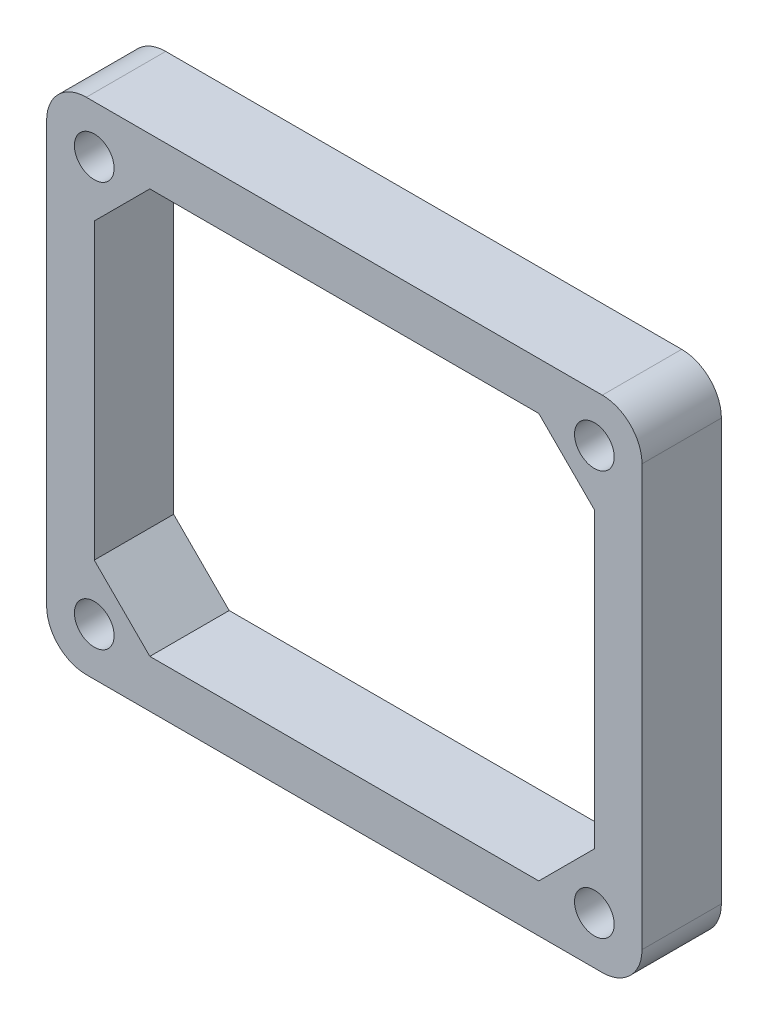
ISO-10303-21;
HEADER;
FILE_DESCRIPTION(('STEP AP214'),'2;1');
FILE_NAME('part.step','',(''),(''),'','','');
FILE_SCHEMA(('AUTOMOTIVE_DESIGN { 1 0 10303 214 1 1 1 1 }'));
ENDSEC;
DATA;
#1=APPLICATION_CONTEXT('core data for automotive mechanical design processes');
#2=APPLICATION_PROTOCOL_DEFINITION('international standard','automotive_design',2000,#1);
#3=PRODUCT_CONTEXT('',#1,'mechanical');
#4=PRODUCT('Part','Part','',(#3));
#5=PRODUCT_RELATED_PRODUCT_CATEGORY('part','',(#4));
#6=PRODUCT_DEFINITION_FORMATION('','',#4);
#7=PRODUCT_DEFINITION_CONTEXT('part definition',#1,'design');
#8=PRODUCT_DEFINITION('design','',#6,#7);
#9=PRODUCT_DEFINITION_SHAPE('','',#8);
#10=(LENGTH_UNIT() NAMED_UNIT(*) SI_UNIT(.MILLI.,.METRE.));
#11=(NAMED_UNIT(*) PLANE_ANGLE_UNIT() SI_UNIT($,.RADIAN.));
#12=(NAMED_UNIT(*) SI_UNIT($,.STERADIAN.) SOLID_ANGLE_UNIT());
#13=UNCERTAINTY_MEASURE_WITH_UNIT(LENGTH_MEASURE(1.E-05),#10,'distance_accuracy_value','');
#14=(GEOMETRIC_REPRESENTATION_CONTEXT(3) GLOBAL_UNCERTAINTY_ASSIGNED_CONTEXT((#13)) GLOBAL_UNIT_ASSIGNED_CONTEXT((#10,
#11,#12)) REPRESENTATION_CONTEXT('',''));
#15=CARTESIAN_POINT('',(0.,0.,0.));
#16=DIRECTION('',(0.,0.,1.));
#17=DIRECTION('',(1.,0.,0.));
#18=AXIS2_PLACEMENT_3D('',#15,#16,#17);
#19=CARTESIAN_POINT('',(0.,0.,10.));
#20=DIRECTION('',(0.,0.,1.));
#21=DIRECTION('',(1.,0.,0.));
#22=AXIS2_PLACEMENT_3D('',#19,#20,#21);
#23=PLANE('',#22);
#24=CARTESIAN_POINT('',(29.6815008445946,-39.8969594594595,10.));
#25=DIRECTION('',(0.,0.,1.));
#26=DIRECTION('',(1.,0.,0.));
#27=AXIS2_PLACEMENT_3D('',#24,#25,#26);
#28=CIRCLE('',#27,2.5);
#29=CARTESIAN_POINT('',(32.1815008445946,-39.8969594594595,10.));
#30=VERTEX_POINT('',#29);
#31=EDGE_CURVE('E569',#30,#30,#28,.T.);
#32=ORIENTED_EDGE('',*,*,#31,.F.);
#33=EDGE_LOOP('',(#32));
#34=FACE_BOUND('',#33,.T.);
#35=CARTESIAN_POINT('',(-33.3184991554054,11.1030405405405,10.));
#36=DIRECTION('',(0.,0.,1.));
#37=DIRECTION('',(1.,0.,0.));
#38=AXIS2_PLACEMENT_3D('',#35,#36,#37);
#39=CIRCLE('',#38,2.5);
#40=CARTESIAN_POINT('',(-30.8184991554054,11.1030405405405,10.));
#41=VERTEX_POINT('',#40);
#42=EDGE_CURVE('E207',#41,#41,#39,.T.);
#43=ORIENTED_EDGE('',*,*,#42,.F.);
#44=EDGE_LOOP('',(#43));
#45=FACE_BOUND('',#44,.T.);
#46=DIRECTION('',(0.,-1.,0.));
#47=VECTOR('',#46,1.);
#48=CARTESIAN_POINT('',(-39.3184991554054,17.1030405405405,10.));
#49=LINE('',#48,#47);
#50=CARTESIAN_POINT('',(-39.3184991554054,12.1030405405405,10.));
#51=VERTEX_POINT('',#50);
#52=CARTESIAN_POINT('',(-39.3184991554054,-40.8969594594595,10.));
#53=VERTEX_POINT('',#52);
#54=EDGE_CURVE('E252',#51,#53,#49,.T.);
#55=ORIENTED_EDGE('',*,*,#54,.T.);
#56=CARTESIAN_POINT('',(-34.3184991554054,-40.8969594594595,10.));
#57=DIRECTION('',(0.,0.,1.));
#58=DIRECTION('',(1.,0.,0.));
#59=AXIS2_PLACEMENT_3D('',#56,#57,#58);
#60=CIRCLE('',#59,5.);
#61=CARTESIAN_POINT('',(-34.3184991554054,-45.8969594594595,10.));
#62=VERTEX_POINT('',#61);
#63=EDGE_CURVE('E314',#53,#62,#60,.T.);
#64=ORIENTED_EDGE('',*,*,#63,.T.);
#65=DIRECTION('',(1.,0.,0.));
#66=VECTOR('',#65,1.);
#67=CARTESIAN_POINT('',(-39.3184991554054,-45.8969594594595,10.));
#68=LINE('',#67,#66);
#69=CARTESIAN_POINT('',(30.6815008445947,-45.8969594594595,10.));
#70=VERTEX_POINT('',#69);
#71=EDGE_CURVE('E256',#62,#70,#68,.T.);
#72=ORIENTED_EDGE('',*,*,#71,.T.);
#73=CARTESIAN_POINT('',(30.6815008445946,-40.8969594594595,10.));
#74=DIRECTION('',(0.,0.,1.));
#75=DIRECTION('',(1.,0.,0.));
#76=AXIS2_PLACEMENT_3D('',#73,#74,#75);
#77=CIRCLE('',#76,5.);
#78=CARTESIAN_POINT('',(35.6815008445947,-40.8969594594595,10.));
#79=VERTEX_POINT('',#78);
#80=EDGE_CURVE('E311',#70,#79,#77,.T.);
#81=ORIENTED_EDGE('',*,*,#80,.T.);
#82=DIRECTION('',(0.,1.,0.));
#83=VECTOR('',#82,1.);
#84=CARTESIAN_POINT('',(35.6815008445946,17.1030405405405,10.));
#85=LINE('',#84,#83);
#86=CARTESIAN_POINT('',(35.6815008445946,12.1030405405405,10.));
#87=VERTEX_POINT('',#86);
#88=EDGE_CURVE('E261',#79,#87,#85,.T.);
#89=ORIENTED_EDGE('',*,*,#88,.T.);
#90=CARTESIAN_POINT('',(30.6815008445946,12.1030405405405,10.));
#91=DIRECTION('',(0.,0.,1.));
#92=DIRECTION('',(1.,0.,0.));
#93=AXIS2_PLACEMENT_3D('',#90,#91,#92);
#94=CIRCLE('',#93,5.);
#95=CARTESIAN_POINT('',(30.6815008445946,17.1030405405405,10.));
#96=VERTEX_POINT('',#95);
#97=EDGE_CURVE('E61',#87,#96,#94,.T.);
#98=ORIENTED_EDGE('',*,*,#97,.T.);
#99=DIRECTION('',(-1.,0.,0.));
#100=VECTOR('',#99,1.);
#101=CARTESIAN_POINT('',(-39.3184991554054,17.1030405405405,10.));
#102=LINE('',#101,#100);
#103=CARTESIAN_POINT('',(-34.3184991554054,17.1030405405405,10.));
#104=VERTEX_POINT('',#103);
#105=EDGE_CURVE('E264',#96,#104,#102,.T.);
#106=ORIENTED_EDGE('',*,*,#105,.T.);
#107=CARTESIAN_POINT('',(-34.3184991554054,12.1030405405405,10.));
#108=DIRECTION('',(0.,0.,1.));
#109=DIRECTION('',(1.,0.,0.));
#110=AXIS2_PLACEMENT_3D('',#107,#108,#109);
#111=CIRCLE('',#110,5.);
#112=EDGE_CURVE('E306',#104,#51,#111,.T.);
#113=ORIENTED_EDGE('',*,*,#112,.T.);
#114=EDGE_LOOP('',(#55,#64,#72,#81,#89,#98,#106,#113));
#115=FACE_BOUND('',#114,.T.);
#116=DIRECTION('',(-0.707106781186547,-0.707106781186548,0.));
#117=VECTOR('',#116,1.);
#118=CARTESIAN_POINT('',(-33.3184991554054,4.10304054054053,10.));
#119=LINE('',#118,#117);
#120=CARTESIAN_POINT('',(-26.3184991554054,11.1030405405405,10.));
#121=VERTEX_POINT('',#120);
#122=CARTESIAN_POINT('',(-33.3184991554054,4.10304054054053,10.));
#123=VERTEX_POINT('',#122);
#124=EDGE_CURVE('E166',#121,#123,#119,.T.);
#125=ORIENTED_EDGE('',*,*,#124,.F.);
#126=DIRECTION('',(-1.,0.,0.));
#127=VECTOR('',#126,1.);
#128=CARTESIAN_POINT('',(-26.3184991554054,11.1030405405405,10.));
#129=LINE('',#128,#127);
#130=CARTESIAN_POINT('',(22.6815008445946,11.1030405405405,10.));
#131=VERTEX_POINT('',#130);
#132=EDGE_CURVE('E155',#131,#121,#129,.T.);
#133=ORIENTED_EDGE('',*,*,#132,.F.);
#134=DIRECTION('',(-0.707106781186547,0.707106781186548,0.));
#135=VECTOR('',#134,1.);
#136=CARTESIAN_POINT('',(22.6815008445946,11.1030405405405,10.));
#137=LINE('',#136,#135);
#138=CARTESIAN_POINT('',(29.6815008445946,4.10304054054053,10.));
#139=VERTEX_POINT('',#138);
#140=EDGE_CURVE('E201',#139,#131,#137,.T.);
#141=ORIENTED_EDGE('',*,*,#140,.F.);
#142=DIRECTION('',(0.,1.,0.));
#143=VECTOR('',#142,1.);
#144=CARTESIAN_POINT('',(29.6815008445946,4.10304054054053,10.));
#145=LINE('',#144,#143);
#146=CARTESIAN_POINT('',(29.6815008445946,-32.8969594594595,10.));
#147=VERTEX_POINT('',#146);
#148=EDGE_CURVE('E197',#147,#139,#145,.T.);
#149=ORIENTED_EDGE('',*,*,#148,.F.);
#150=DIRECTION('',(0.707106781186547,0.707106781186547,0.));
#151=VECTOR('',#150,1.);
#152=CARTESIAN_POINT('',(29.6815008445946,-32.8969594594595,10.));
#153=LINE('',#152,#151);
#154=CARTESIAN_POINT('',(22.6815008445946,-39.8969594594595,10.));
#155=VERTEX_POINT('',#154);
#156=EDGE_CURVE('E194',#155,#147,#153,.T.);
#157=ORIENTED_EDGE('',*,*,#156,.F.);
#158=DIRECTION('',(1.,0.,0.));
#159=VECTOR('',#158,1.);
#160=CARTESIAN_POINT('',(-26.3184991554054,-39.8969594594595,10.));
#161=LINE('',#160,#159);
#162=CARTESIAN_POINT('',(-26.3184991554054,-39.8969594594595,10.));
#163=VERTEX_POINT('',#162);
#164=EDGE_CURVE('E191',#163,#155,#161,.T.);
#165=ORIENTED_EDGE('',*,*,#164,.F.);
#166=DIRECTION('',(0.707106781186547,-0.707106781186547,0.));
#167=VECTOR('',#166,1.);
#168=CARTESIAN_POINT('',(-33.3184991554054,-32.8969594594595,10.));
#169=LINE('',#168,#167);
#170=CARTESIAN_POINT('',(-33.3184991554054,-32.8969594594595,10.));
#171=VERTEX_POINT('',#170);
#172=EDGE_CURVE('E185',#171,#163,#169,.T.);
#173=ORIENTED_EDGE('',*,*,#172,.F.);
#174=DIRECTION('',(0.,-1.,0.));
#175=VECTOR('',#174,1.);
#176=CARTESIAN_POINT('',(-33.3184991554054,4.10304054054053,10.));
#177=LINE('',#176,#175);
#178=EDGE_CURVE('E181',#123,#171,#177,.T.);
#179=ORIENTED_EDGE('',*,*,#178,.F.);
#180=EDGE_LOOP('',(#125,#133,#141,#149,#157,#165,#173,#179));
#181=FACE_BOUND('',#180,.T.);
#182=CARTESIAN_POINT('',(29.6815008445946,11.1030405405405,10.));
#183=DIRECTION('',(0.,0.,1.));
#184=DIRECTION('',(1.,0.,0.));
#185=AXIS2_PLACEMENT_3D('',#182,#183,#184);
#186=CIRCLE('',#185,2.5);
#187=CARTESIAN_POINT('',(32.1815008445946,11.1030405405405,10.));
#188=VERTEX_POINT('',#187);
#189=EDGE_CURVE('E577',#188,#188,#186,.T.);
#190=ORIENTED_EDGE('',*,*,#189,.F.);
#191=EDGE_LOOP('',(#190));
#192=FACE_BOUND('',#191,.T.);
#193=CARTESIAN_POINT('',(-33.3184991554054,-39.8969594594595,10.));
#194=DIRECTION('',(0.,0.,1.));
#195=DIRECTION('',(1.,0.,0.));
#196=AXIS2_PLACEMENT_3D('',#193,#194,#195);
#197=CIRCLE('',#196,2.5);
#198=CARTESIAN_POINT('',(-30.8184991554054,-39.8969594594595,10.));
#199=VERTEX_POINT('',#198);
#200=EDGE_CURVE('E558',#199,#199,#197,.T.);
#201=ORIENTED_EDGE('',*,*,#200,.F.);
#202=EDGE_LOOP('',(#201));
#203=FACE_BOUND('',#202,.T.);
#204=ADVANCED_FACE('F39',(#34,#45,#115,#181,#192,#203),#23,.T.);
#205=CARTESIAN_POINT('',(0.,0.,0.));
#206=DIRECTION('',(0.,0.,1.));
#207=DIRECTION('',(1.,0.,0.));
#208=AXIS2_PLACEMENT_3D('',#205,#206,#207);
#209=PLANE('',#208);
#210=DIRECTION('',(1.,0.,0.));
#211=VECTOR('',#210,1.);
#212=CARTESIAN_POINT('',(-39.3184991554054,-45.8969594594595,0.));
#213=LINE('',#212,#211);
#214=CARTESIAN_POINT('',(-34.3184991554054,-45.8969594594595,0.));
#215=VERTEX_POINT('',#214);
#216=CARTESIAN_POINT('',(30.6815008445947,-45.8969594594595,0.));
#217=VERTEX_POINT('',#216);
#218=EDGE_CURVE('E271',#215,#217,#213,.T.);
#219=ORIENTED_EDGE('',*,*,#218,.F.);
#220=CARTESIAN_POINT('',(-34.3184991554054,-40.8969594594595,0.));
#221=DIRECTION('',(0.,0.,1.));
#222=DIRECTION('',(1.,0.,0.));
#223=AXIS2_PLACEMENT_3D('',#220,#221,#222);
#224=CIRCLE('',#223,5.);
#225=CARTESIAN_POINT('',(-39.3184991554054,-40.8969594594595,0.));
#226=VERTEX_POINT('',#225);
#227=EDGE_CURVE('E296',#215,#226,#224,.F.);
#228=ORIENTED_EDGE('',*,*,#227,.T.);
#229=DIRECTION('',(0.,-1.,0.));
#230=VECTOR('',#229,1.);
#231=CARTESIAN_POINT('',(-39.3184991554054,17.1030405405405,0.));
#232=LINE('',#231,#230);
#233=CARTESIAN_POINT('',(-39.3184991554054,12.1030405405405,0.));
#234=VERTEX_POINT('',#233);
#235=EDGE_CURVE('E175',#234,#226,#232,.T.);
#236=ORIENTED_EDGE('',*,*,#235,.F.);
#237=CARTESIAN_POINT('',(-34.3184991554054,12.1030405405405,0.));
#238=DIRECTION('',(0.,0.,1.));
#239=DIRECTION('',(1.,0.,0.));
#240=AXIS2_PLACEMENT_3D('',#237,#238,#239);
#241=CIRCLE('',#240,5.);
#242=CARTESIAN_POINT('',(-34.3184991554054,17.1030405405405,0.));
#243=VERTEX_POINT('',#242);
#244=EDGE_CURVE('E287',#234,#243,#241,.F.);
#245=ORIENTED_EDGE('',*,*,#244,.T.);
#246=DIRECTION('',(-1.,0.,0.));
#247=VECTOR('',#246,1.);
#248=CARTESIAN_POINT('',(-39.3184991554054,17.1030405405405,0.));
#249=LINE('',#248,#247);
#250=CARTESIAN_POINT('',(30.6815008445946,17.1030405405405,0.));
#251=VERTEX_POINT('',#250);
#252=EDGE_CURVE('E257',#251,#243,#249,.T.);
#253=ORIENTED_EDGE('',*,*,#252,.F.);
#254=CARTESIAN_POINT('',(30.6815008445946,12.1030405405405,0.));
#255=DIRECTION('',(0.,0.,1.));
#256=DIRECTION('',(1.,0.,0.));
#257=AXIS2_PLACEMENT_3D('',#254,#255,#256);
#258=CIRCLE('',#257,5.);
#259=CARTESIAN_POINT('',(35.6815008445946,12.1030405405405,0.));
#260=VERTEX_POINT('',#259);
#261=EDGE_CURVE('E290',#251,#260,#258,.F.);
#262=ORIENTED_EDGE('',*,*,#261,.T.);
#263=DIRECTION('',(0.,1.,0.));
#264=VECTOR('',#263,1.);
#265=CARTESIAN_POINT('',(35.6815008445946,17.1030405405405,0.));
#266=LINE('',#265,#264);
#267=CARTESIAN_POINT('',(35.6815008445947,-40.8969594594595,0.));
#268=VERTEX_POINT('',#267);
#269=EDGE_CURVE('E275',#268,#260,#266,.T.);
#270=ORIENTED_EDGE('',*,*,#269,.F.);
#271=CARTESIAN_POINT('',(30.6815008445946,-40.8969594594595,0.));
#272=DIRECTION('',(0.,0.,1.));
#273=DIRECTION('',(1.,0.,0.));
#274=AXIS2_PLACEMENT_3D('',#271,#272,#273);
#275=CIRCLE('',#274,5.);
#276=EDGE_CURVE('E293',#268,#217,#275,.F.);
#277=ORIENTED_EDGE('',*,*,#276,.T.);
#278=EDGE_LOOP('',(#219,#228,#236,#245,#253,#262,#270,#277));
#279=FACE_BOUND('',#278,.T.);
#280=DIRECTION('',(-1.,0.,0.));
#281=VECTOR('',#280,1.);
#282=CARTESIAN_POINT('',(-26.3184991554054,11.1030405405405,0.));
#283=LINE('',#282,#281);
#284=CARTESIAN_POINT('',(22.6815008445946,11.1030405405405,0.));
#285=VERTEX_POINT('',#284);
#286=CARTESIAN_POINT('',(-26.3184991554054,11.1030405405405,0.));
#287=VERTEX_POINT('',#286);
#288=EDGE_CURVE('E204',#285,#287,#283,.T.);
#289=ORIENTED_EDGE('',*,*,#288,.T.);
#290=DIRECTION('',(-0.707106781186547,-0.707106781186548,0.));
#291=VECTOR('',#290,1.);
#292=CARTESIAN_POINT('',(-33.3184991554054,4.10304054054053,0.));
#293=LINE('',#292,#291);
#294=CARTESIAN_POINT('',(-33.3184991554054,4.10304054054053,0.));
#295=VERTEX_POINT('',#294);
#296=EDGE_CURVE('E173',#287,#295,#293,.T.);
#297=ORIENTED_EDGE('',*,*,#296,.T.);
#298=DIRECTION('',(0.,-1.,0.));
#299=VECTOR('',#298,1.);
#300=CARTESIAN_POINT('',(-33.3184991554054,4.10304054054053,0.));
#301=LINE('',#300,#299);
#302=CARTESIAN_POINT('',(-33.3184991554054,-32.8969594594595,0.));
#303=VERTEX_POINT('',#302);
#304=EDGE_CURVE('E210',#295,#303,#301,.T.);
#305=ORIENTED_EDGE('',*,*,#304,.T.);
#306=DIRECTION('',(0.707106781186547,-0.707106781186547,0.));
#307=VECTOR('',#306,1.);
#308=CARTESIAN_POINT('',(-33.3184991554054,-32.8969594594595,0.));
#309=LINE('',#308,#307);
#310=CARTESIAN_POINT('',(-26.3184991554054,-39.8969594594595,0.));
#311=VERTEX_POINT('',#310);
#312=EDGE_CURVE('E214',#303,#311,#309,.T.);
#313=ORIENTED_EDGE('',*,*,#312,.T.);
#314=DIRECTION('',(1.,0.,0.));
#315=VECTOR('',#314,1.);
#316=CARTESIAN_POINT('',(-26.3184991554054,-39.8969594594595,0.));
#317=LINE('',#316,#315);
#318=CARTESIAN_POINT('',(22.6815008445946,-39.8969594594595,0.));
#319=VERTEX_POINT('',#318);
#320=EDGE_CURVE('E218',#311,#319,#317,.T.);
#321=ORIENTED_EDGE('',*,*,#320,.T.);
#322=DIRECTION('',(0.707106781186547,0.707106781186547,0.));
#323=VECTOR('',#322,1.);
#324=CARTESIAN_POINT('',(29.6815008445946,-32.8969594594595,0.));
#325=LINE('',#324,#323);
#326=CARTESIAN_POINT('',(29.6815008445946,-32.8969594594595,0.));
#327=VERTEX_POINT('',#326);
#328=EDGE_CURVE('E222',#319,#327,#325,.T.);
#329=ORIENTED_EDGE('',*,*,#328,.T.);
#330=DIRECTION('',(0.,1.,0.));
#331=VECTOR('',#330,1.);
#332=CARTESIAN_POINT('',(29.6815008445946,4.10304054054053,0.));
#333=LINE('',#332,#331);
#334=CARTESIAN_POINT('',(29.6815008445946,4.10304054054053,0.));
#335=VERTEX_POINT('',#334);
#336=EDGE_CURVE('E226',#327,#335,#333,.T.);
#337=ORIENTED_EDGE('',*,*,#336,.T.);
#338=DIRECTION('',(-0.707106781186547,0.707106781186548,0.));
#339=VECTOR('',#338,1.);
#340=CARTESIAN_POINT('',(22.6815008445946,11.1030405405405,0.));
#341=LINE('',#340,#339);
#342=EDGE_CURVE('E167',#335,#285,#341,.T.);
#343=ORIENTED_EDGE('',*,*,#342,.T.);
#344=EDGE_LOOP('',(#289,#297,#305,#313,#321,#329,#337,#343));
#345=FACE_BOUND('',#344,.T.);
#346=CARTESIAN_POINT('',(-33.3184991554054,11.1030405405405,0.));
#347=DIRECTION('',(0.,0.,1.));
#348=DIRECTION('',(1.,0.,0.));
#349=AXIS2_PLACEMENT_3D('',#346,#347,#348);
#350=CIRCLE('',#349,2.5);
#351=CARTESIAN_POINT('',(-30.8184991554054,11.1030405405405,0.));
#352=VERTEX_POINT('',#351);
#353=EDGE_CURVE('E581',#352,#352,#350,.T.);
#354=ORIENTED_EDGE('',*,*,#353,.T.);
#355=EDGE_LOOP('',(#354));
#356=FACE_BOUND('',#355,.T.);
#357=CARTESIAN_POINT('',(29.6815008445946,11.1030405405405,0.));
#358=DIRECTION('',(0.,0.,1.));
#359=DIRECTION('',(1.,0.,0.));
#360=AXIS2_PLACEMENT_3D('',#357,#358,#359);
#361=CIRCLE('',#360,2.5);
#362=CARTESIAN_POINT('',(32.1815008445946,11.1030405405405,0.));
#363=VERTEX_POINT('',#362);
#364=EDGE_CURVE('E573',#363,#363,#361,.T.);
#365=ORIENTED_EDGE('',*,*,#364,.T.);
#366=EDGE_LOOP('',(#365));
#367=FACE_BOUND('',#366,.T.);
#368=CARTESIAN_POINT('',(29.6815008445946,-39.8969594594595,0.));
#369=DIRECTION('',(0.,0.,1.));
#370=DIRECTION('',(1.,0.,0.));
#371=AXIS2_PLACEMENT_3D('',#368,#369,#370);
#372=CIRCLE('',#371,2.5);
#373=CARTESIAN_POINT('',(32.1815008445946,-39.8969594594595,0.));
#374=VERTEX_POINT('',#373);
#375=EDGE_CURVE('E566',#374,#374,#372,.T.);
#376=ORIENTED_EDGE('',*,*,#375,.T.);
#377=EDGE_LOOP('',(#376));
#378=FACE_BOUND('',#377,.T.);
#379=CARTESIAN_POINT('',(-33.3184991554054,-39.8969594594595,0.));
#380=DIRECTION('',(0.,0.,1.));
#381=DIRECTION('',(1.,0.,0.));
#382=AXIS2_PLACEMENT_3D('',#379,#380,#381);
#383=CIRCLE('',#382,2.5);
#384=CARTESIAN_POINT('',(-30.8184991554054,-39.8969594594595,0.));
#385=VERTEX_POINT('',#384);
#386=EDGE_CURVE('E561',#385,#385,#383,.T.);
#387=ORIENTED_EDGE('',*,*,#386,.T.);
#388=EDGE_LOOP('',(#387));
#389=FACE_BOUND('',#388,.T.);
#390=ADVANCED_FACE('F334',(#279,#345,#356,#367,#378,#389),#209,.F.);
#391=CARTESIAN_POINT('',(-39.3184991554054,17.1030405405405,10.));
#392=DIRECTION('',(1.,0.,0.));
#393=DIRECTION('',(0.,1.,0.));
#394=AXIS2_PLACEMENT_3D('',#391,#392,#393);
#395=PLANE('',#394);
#396=ORIENTED_EDGE('',*,*,#235,.T.);
#397=DIRECTION('',(0.,0.,-1.));
#398=VECTOR('',#397,1.);
#399=CARTESIAN_POINT('',(-39.3184991554054,-40.8969594594595,10.));
#400=LINE('',#399,#398);
#401=EDGE_CURVE('E303',#226,#53,#400,.F.);
#402=ORIENTED_EDGE('',*,*,#401,.T.);
#403=ORIENTED_EDGE('',*,*,#54,.F.);
#404=DIRECTION('',(0.,0.,-1.));
#405=VECTOR('',#404,1.);
#406=CARTESIAN_POINT('',(-39.3184991554054,12.1030405405405,10.));
#407=LINE('',#406,#405);
#408=EDGE_CURVE('E299',#51,#234,#407,.T.);
#409=ORIENTED_EDGE('',*,*,#408,.T.);
#410=EDGE_LOOP('',(#396,#402,#403,#409));
#411=FACE_BOUND('',#410,.T.);
#412=ADVANCED_FACE('F347',(#411),#395,.F.);
#413=CARTESIAN_POINT('',(-39.3184991554054,-45.8969594594595,10.));
#414=DIRECTION('',(0.,1.,0.));
#415=DIRECTION('',(0.,0.,1.));
#416=AXIS2_PLACEMENT_3D('',#413,#414,#415);
#417=PLANE('',#416);
#418=ORIENTED_EDGE('',*,*,#71,.F.);
#419=DIRECTION('',(0.,0.,-1.));
#420=VECTOR('',#419,1.);
#421=CARTESIAN_POINT('',(-34.3184991554054,-45.8969594594595,10.));
#422=LINE('',#421,#420);
#423=EDGE_CURVE('E283',#62,#215,#422,.T.);
#424=ORIENTED_EDGE('',*,*,#423,.T.);
#425=ORIENTED_EDGE('',*,*,#218,.T.);
#426=DIRECTION('',(0.,0.,-1.));
#427=VECTOR('',#426,1.);
#428=CARTESIAN_POINT('',(30.6815008445947,-45.8969594594595,10.));
#429=LINE('',#428,#427);
#430=EDGE_CURVE('E267',#217,#70,#429,.F.);
#431=ORIENTED_EDGE('',*,*,#430,.T.);
#432=EDGE_LOOP('',(#418,#424,#425,#431));
#433=FACE_BOUND('',#432,.T.);
#434=ADVANCED_FACE('F355',(#433),#417,.F.);
#435=CARTESIAN_POINT('',(35.6815008445946,17.1030405405405,10.));
#436=DIRECTION('',(-1.,0.,0.));
#437=DIRECTION('',(0.,-1.,0.));
#438=AXIS2_PLACEMENT_3D('',#435,#436,#437);
#439=PLANE('',#438);
#440=ORIENTED_EDGE('',*,*,#88,.F.);
#441=DIRECTION('',(0.,0.,-1.));
#442=VECTOR('',#441,1.);
#443=CARTESIAN_POINT('',(35.6815008445947,-40.8969594594595,10.));
#444=LINE('',#443,#442);
#445=EDGE_CURVE('E320',#79,#268,#444,.T.);
#446=ORIENTED_EDGE('',*,*,#445,.T.);
#447=ORIENTED_EDGE('',*,*,#269,.T.);
#448=DIRECTION('',(0.,0.,-1.));
#449=VECTOR('',#448,1.);
#450=CARTESIAN_POINT('',(35.6815008445946,12.1030405405405,10.));
#451=LINE('',#450,#449);
#452=EDGE_CURVE('E317',#260,#87,#451,.F.);
#453=ORIENTED_EDGE('',*,*,#452,.T.);
#454=EDGE_LOOP('',(#440,#446,#447,#453));
#455=FACE_BOUND('',#454,.T.);
#456=ADVANCED_FACE('F328',(#455),#439,.F.);
#457=CARTESIAN_POINT('',(-39.3184991554054,17.1030405405405,10.));
#458=DIRECTION('',(0.,-1.,0.));
#459=DIRECTION('',(0.,0.,-1.));
#460=AXIS2_PLACEMENT_3D('',#457,#458,#459);
#461=PLANE('',#460);
#462=ORIENTED_EDGE('',*,*,#105,.F.);
#463=DIRECTION('',(0.,0.,-1.));
#464=VECTOR('',#463,1.);
#465=CARTESIAN_POINT('',(30.6815008445946,17.1030405405405,10.));
#466=LINE('',#465,#464);
#467=EDGE_CURVE('E11',#96,#251,#466,.T.);
#468=ORIENTED_EDGE('',*,*,#467,.T.);
#469=ORIENTED_EDGE('',*,*,#252,.T.);
#470=DIRECTION('',(0.,0.,-1.));
#471=VECTOR('',#470,1.);
#472=CARTESIAN_POINT('',(-34.3184991554054,17.1030405405405,10.));
#473=LINE('',#472,#471);
#474=EDGE_CURVE('E48',#243,#104,#473,.F.);
#475=ORIENTED_EDGE('',*,*,#474,.T.);
#476=EDGE_LOOP('',(#462,#468,#469,#475));
#477=FACE_BOUND('',#476,.T.);
#478=ADVANCED_FACE('F340',(#477),#461,.F.);
#479=CARTESIAN_POINT('',(-26.3184991554054,11.1030405405405,10.));
#480=DIRECTION('',(0.,-1.,0.));
#481=DIRECTION('',(0.,0.,-1.));
#482=AXIS2_PLACEMENT_3D('',#479,#480,#481);
#483=PLANE('',#482);
#484=ORIENTED_EDGE('',*,*,#288,.F.);
#485=DIRECTION('',(0.,0.,-1.));
#486=VECTOR('',#485,1.);
#487=CARTESIAN_POINT('',(22.6815008445946,11.1030405405405,10.));
#488=LINE('',#487,#486);
#489=EDGE_CURVE('E161',#131,#285,#488,.T.);
#490=ORIENTED_EDGE('',*,*,#489,.F.);
#491=ORIENTED_EDGE('',*,*,#132,.T.);
#492=DIRECTION('',(0.,0.,-1.));
#493=VECTOR('',#492,1.);
#494=CARTESIAN_POINT('',(-26.3184991554054,11.1030405405405,10.));
#495=LINE('',#494,#493);
#496=EDGE_CURVE('E158',#121,#287,#495,.T.);
#497=ORIENTED_EDGE('',*,*,#496,.T.);
#498=EDGE_LOOP('',(#484,#490,#491,#497));
#499=FACE_BOUND('',#498,.T.);
#500=ADVANCED_FACE('F157',(#499),#483,.T.);
#501=CARTESIAN_POINT('',(-33.3184991554054,4.10304054054053,10.));
#502=DIRECTION('',(0.707106781186548,-0.707106781186547,0.));
#503=DIRECTION('',(0.707106781186547,0.707106781186548,0.));
#504=AXIS2_PLACEMENT_3D('',#501,#502,#503);
#505=PLANE('',#504);
#506=ORIENTED_EDGE('',*,*,#296,.F.);
#507=ORIENTED_EDGE('',*,*,#496,.F.);
#508=ORIENTED_EDGE('',*,*,#124,.T.);
#509=DIRECTION('',(0.,0.,-1.));
#510=VECTOR('',#509,1.);
#511=CARTESIAN_POINT('',(-33.3184991554054,4.10304054054053,10.));
#512=LINE('',#511,#510);
#513=EDGE_CURVE('E176',#123,#295,#512,.T.);
#514=ORIENTED_EDGE('',*,*,#513,.T.);
#515=EDGE_LOOP('',(#506,#507,#508,#514));
#516=FACE_BOUND('',#515,.T.);
#517=ADVANCED_FACE('F170',(#516),#505,.T.);
#518=CARTESIAN_POINT('',(-33.3184991554054,4.10304054054053,10.));
#519=DIRECTION('',(1.,0.,0.));
#520=DIRECTION('',(0.,1.,0.));
#521=AXIS2_PLACEMENT_3D('',#518,#519,#520);
#522=PLANE('',#521);
#523=ORIENTED_EDGE('',*,*,#304,.F.);
#524=ORIENTED_EDGE('',*,*,#513,.F.);
#525=ORIENTED_EDGE('',*,*,#178,.T.);
#526=DIRECTION('',(0.,0.,-1.));
#527=VECTOR('',#526,1.);
#528=CARTESIAN_POINT('',(-33.3184991554054,-32.8969594594595,10.));
#529=LINE('',#528,#527);
#530=EDGE_CURVE('E247',#171,#303,#529,.T.);
#531=ORIENTED_EDGE('',*,*,#530,.T.);
#532=EDGE_LOOP('',(#523,#524,#525,#531));
#533=FACE_BOUND('',#532,.T.);
#534=ADVANCED_FACE('F413',(#533),#522,.T.);
#535=CARTESIAN_POINT('',(-33.3184991554054,-32.8969594594595,10.));
#536=DIRECTION('',(0.707106781186548,0.707106781186548,0.));
#537=DIRECTION('',(-0.707106781186548,0.707106781186548,0.));
#538=AXIS2_PLACEMENT_3D('',#535,#536,#537);
#539=PLANE('',#538);
#540=ORIENTED_EDGE('',*,*,#312,.F.);
#541=ORIENTED_EDGE('',*,*,#530,.F.);
#542=ORIENTED_EDGE('',*,*,#172,.T.);
#543=DIRECTION('',(0.,0.,-1.));
#544=VECTOR('',#543,1.);
#545=CARTESIAN_POINT('',(-26.3184991554054,-39.8969594594595,10.));
#546=LINE('',#545,#544);
#547=EDGE_CURVE('E244',#163,#311,#546,.T.);
#548=ORIENTED_EDGE('',*,*,#547,.T.);
#549=EDGE_LOOP('',(#540,#541,#542,#548));
#550=FACE_BOUND('',#549,.T.);
#551=ADVANCED_FACE('F419',(#550),#539,.T.);
#552=CARTESIAN_POINT('',(-26.3184991554054,-39.8969594594595,10.));
#553=DIRECTION('',(0.,1.,0.));
#554=DIRECTION('',(0.,0.,1.));
#555=AXIS2_PLACEMENT_3D('',#552,#553,#554);
#556=PLANE('',#555);
#557=ORIENTED_EDGE('',*,*,#320,.F.);
#558=ORIENTED_EDGE('',*,*,#547,.F.);
#559=ORIENTED_EDGE('',*,*,#164,.T.);
#560=DIRECTION('',(0.,0.,-1.));
#561=VECTOR('',#560,1.);
#562=CARTESIAN_POINT('',(22.6815008445946,-39.8969594594595,10.));
#563=LINE('',#562,#561);
#564=EDGE_CURVE('E241',#155,#319,#563,.T.);
#565=ORIENTED_EDGE('',*,*,#564,.T.);
#566=EDGE_LOOP('',(#557,#558,#559,#565));
#567=FACE_BOUND('',#566,.T.);
#568=ADVANCED_FACE('F427',(#567),#556,.T.);
#569=CARTESIAN_POINT('',(29.6815008445946,-32.8969594594595,10.));
#570=DIRECTION('',(-0.707106781186548,0.707106781186548,0.));
#571=DIRECTION('',(-0.707106781186548,-0.707106781186548,0.));
#572=AXIS2_PLACEMENT_3D('',#569,#570,#571);
#573=PLANE('',#572);
#574=ORIENTED_EDGE('',*,*,#328,.F.);
#575=ORIENTED_EDGE('',*,*,#564,.F.);
#576=ORIENTED_EDGE('',*,*,#156,.T.);
#577=DIRECTION('',(0.,0.,-1.));
#578=VECTOR('',#577,1.);
#579=CARTESIAN_POINT('',(29.6815008445946,-32.8969594594595,10.));
#580=LINE('',#579,#578);
#581=EDGE_CURVE('E238',#147,#327,#580,.T.);
#582=ORIENTED_EDGE('',*,*,#581,.T.);
#583=EDGE_LOOP('',(#574,#575,#576,#582));
#584=FACE_BOUND('',#583,.T.);
#585=ADVANCED_FACE('F435',(#584),#573,.T.);
#586=CARTESIAN_POINT('',(29.6815008445946,4.10304054054053,10.));
#587=DIRECTION('',(-1.,0.,0.));
#588=DIRECTION('',(0.,0.,1.));
#589=AXIS2_PLACEMENT_3D('',#586,#587,#588);
#590=PLANE('',#589);
#591=ORIENTED_EDGE('',*,*,#336,.F.);
#592=ORIENTED_EDGE('',*,*,#581,.F.);
#593=ORIENTED_EDGE('',*,*,#148,.T.);
#594=DIRECTION('',(0.,0.,-1.));
#595=VECTOR('',#594,1.);
#596=CARTESIAN_POINT('',(29.6815008445946,4.10304054054053,10.));
#597=LINE('',#596,#595);
#598=EDGE_CURVE('E235',#139,#335,#597,.T.);
#599=ORIENTED_EDGE('',*,*,#598,.T.);
#600=EDGE_LOOP('',(#591,#592,#593,#599));
#601=FACE_BOUND('',#600,.T.);
#602=ADVANCED_FACE('F443',(#601),#590,.T.);
#603=CARTESIAN_POINT('',(22.6815008445946,11.1030405405405,10.));
#604=DIRECTION('',(-0.707106781186548,-0.707106781186547,0.));
#605=DIRECTION('',(0.707106781186547,-0.707106781186548,0.));
#606=AXIS2_PLACEMENT_3D('',#603,#604,#605);
#607=PLANE('',#606);
#608=ORIENTED_EDGE('',*,*,#342,.F.);
#609=ORIENTED_EDGE('',*,*,#598,.F.);
#610=ORIENTED_EDGE('',*,*,#140,.T.);
#611=ORIENTED_EDGE('',*,*,#489,.T.);
#612=EDGE_LOOP('',(#608,#609,#610,#611));
#613=FACE_BOUND('',#612,.T.);
#614=ADVANCED_FACE('F451',(#613),#607,.T.);
#615=CARTESIAN_POINT('',(-33.3184991554054,11.1030405405405,10.));
#616=DIRECTION('',(0.,0.,-1.));
#617=DIRECTION('',(-1.,0.,0.));
#618=AXIS2_PLACEMENT_3D('',#615,#616,#617);
#619=CYLINDRICAL_SURFACE('',#618,2.5);
#620=ORIENTED_EDGE('',*,*,#42,.T.);
#621=EDGE_LOOP('',(#620));
#622=FACE_BOUND('',#621,.T.);
#623=ORIENTED_EDGE('',*,*,#353,.F.);
#624=EDGE_LOOP('',(#623));
#625=FACE_BOUND('',#624,.T.);
#626=ADVANCED_FACE('F459',(#622,#625),#619,.F.);
#627=CARTESIAN_POINT('',(29.6815008445946,11.1030405405405,10.));
#628=DIRECTION('',(0.,0.,-1.));
#629=DIRECTION('',(-1.,0.,0.));
#630=AXIS2_PLACEMENT_3D('',#627,#628,#629);
#631=CYLINDRICAL_SURFACE('',#630,2.5);
#632=ORIENTED_EDGE('',*,*,#189,.T.);
#633=EDGE_LOOP('',(#632));
#634=FACE_BOUND('',#633,.T.);
#635=ORIENTED_EDGE('',*,*,#364,.F.);
#636=EDGE_LOOP('',(#635));
#637=FACE_BOUND('',#636,.T.);
#638=ADVANCED_FACE('F467',(#634,#637),#631,.F.);
#639=CARTESIAN_POINT('',(29.6815008445946,-39.8969594594595,10.));
#640=DIRECTION('',(0.,0.,-1.));
#641=DIRECTION('',(-1.,0.,0.));
#642=AXIS2_PLACEMENT_3D('',#639,#640,#641);
#643=CYLINDRICAL_SURFACE('',#642,2.5);
#644=ORIENTED_EDGE('',*,*,#31,.T.);
#645=EDGE_LOOP('',(#644));
#646=FACE_BOUND('',#645,.T.);
#647=ORIENTED_EDGE('',*,*,#375,.F.);
#648=EDGE_LOOP('',(#647));
#649=FACE_BOUND('',#648,.T.);
#650=ADVANCED_FACE('F475',(#646,#649),#643,.F.);
#651=CARTESIAN_POINT('',(-33.3184991554054,-39.8969594594595,10.));
#652=DIRECTION('',(0.,0.,-1.));
#653=DIRECTION('',(-1.,0.,0.));
#654=AXIS2_PLACEMENT_3D('',#651,#652,#653);
#655=CYLINDRICAL_SURFACE('',#654,2.5);
#656=ORIENTED_EDGE('',*,*,#200,.T.);
#657=EDGE_LOOP('',(#656));
#658=FACE_BOUND('',#657,.T.);
#659=ORIENTED_EDGE('',*,*,#386,.F.);
#660=EDGE_LOOP('',(#659));
#661=FACE_BOUND('',#660,.T.);
#662=ADVANCED_FACE('F364',(#658,#661),#655,.F.);
#663=CARTESIAN_POINT('',(-34.3184991554054,-40.8969594594595,10.));
#664=DIRECTION('',(0.,0.,-1.));
#665=DIRECTION('',(-1.,0.,0.));
#666=AXIS2_PLACEMENT_3D('',#663,#664,#665);
#667=CYLINDRICAL_SURFACE('',#666,5.);
#668=ORIENTED_EDGE('',*,*,#63,.F.);
#669=ORIENTED_EDGE('',*,*,#401,.F.);
#670=ORIENTED_EDGE('',*,*,#227,.F.);
#671=ORIENTED_EDGE('',*,*,#423,.F.);
#672=EDGE_LOOP('',(#668,#669,#670,#671));
#673=FACE_BOUND('',#672,.T.);
#674=ADVANCED_FACE('F352',(#673),#667,.T.);
#675=CARTESIAN_POINT('',(30.6815008445946,-40.8969594594595,10.));
#676=DIRECTION('',(0.,0.,-1.));
#677=DIRECTION('',(-1.,0.,0.));
#678=AXIS2_PLACEMENT_3D('',#675,#676,#677);
#679=CYLINDRICAL_SURFACE('',#678,5.);
#680=ORIENTED_EDGE('',*,*,#80,.F.);
#681=ORIENTED_EDGE('',*,*,#430,.F.);
#682=ORIENTED_EDGE('',*,*,#276,.F.);
#683=ORIENTED_EDGE('',*,*,#445,.F.);
#684=EDGE_LOOP('',(#680,#681,#682,#683));
#685=FACE_BOUND('',#684,.T.);
#686=ADVANCED_FACE('F357',(#685),#679,.T.);
#687=CARTESIAN_POINT('',(30.6815008445946,12.1030405405405,10.));
#688=DIRECTION('',(0.,0.,-1.));
#689=DIRECTION('',(-1.,0.,0.));
#690=AXIS2_PLACEMENT_3D('',#687,#688,#689);
#691=CYLINDRICAL_SURFACE('',#690,5.);
#692=ORIENTED_EDGE('',*,*,#97,.F.);
#693=ORIENTED_EDGE('',*,*,#452,.F.);
#694=ORIENTED_EDGE('',*,*,#261,.F.);
#695=ORIENTED_EDGE('',*,*,#467,.F.);
#696=EDGE_LOOP('',(#692,#693,#694,#695));
#697=FACE_BOUND('',#696,.T.);
#698=ADVANCED_FACE('F339',(#697),#691,.T.);
#699=CARTESIAN_POINT('',(-34.3184991554054,12.1030405405405,10.));
#700=DIRECTION('',(0.,0.,-1.));
#701=DIRECTION('',(-1.,0.,0.));
#702=AXIS2_PLACEMENT_3D('',#699,#700,#701);
#703=CYLINDRICAL_SURFACE('',#702,5.);
#704=ORIENTED_EDGE('',*,*,#112,.F.);
#705=ORIENTED_EDGE('',*,*,#474,.F.);
#706=ORIENTED_EDGE('',*,*,#244,.F.);
#707=ORIENTED_EDGE('',*,*,#408,.F.);
#708=EDGE_LOOP('',(#704,#705,#706,#707));
#709=FACE_BOUND('',#708,.T.);
#710=ADVANCED_FACE('F41',(#709),#703,.T.);
#711=CLOSED_SHELL('',(#204,#390,#412,#434,#456,#478,#500,#517,#534,#551,#568,#585,#602,#614,
#626,#638,#650,#662,#674,#686,#698,#710));
#712=MANIFOLD_SOLID_BREP('B2',#711);
#713=ADVANCED_BREP_SHAPE_REPRESENTATION('',(#18,#712),#14);
#714=SHAPE_DEFINITION_REPRESENTATION(#9,#713);
ENDSEC;
END-ISO-10303-21;
